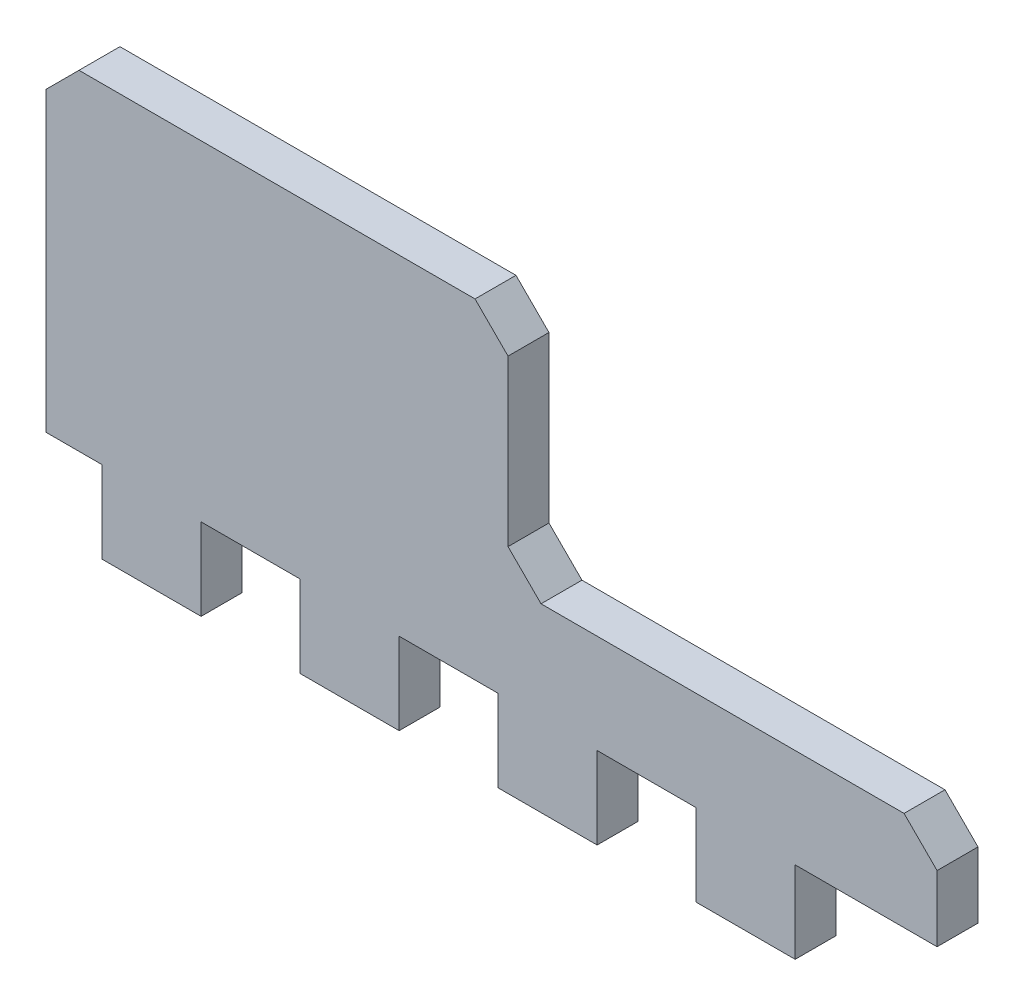
ISO-10303-21;
HEADER;
FILE_DESCRIPTION(('STEP AP214'),'2;1');
FILE_NAME('part.step','',(''),(''),'','','');
FILE_SCHEMA(('AUTOMOTIVE_DESIGN { 1 0 10303 214 1 1 1 1 }'));
ENDSEC;
DATA;
#1=APPLICATION_CONTEXT('core data for automotive mechanical design processes');
#2=APPLICATION_PROTOCOL_DEFINITION('international standard','automotive_design',2000,#1);
#3=PRODUCT_CONTEXT('',#1,'mechanical');
#4=PRODUCT('Part','Part','',(#3));
#5=PRODUCT_RELATED_PRODUCT_CATEGORY('part','',(#4));
#6=PRODUCT_DEFINITION_FORMATION('','',#4);
#7=PRODUCT_DEFINITION_CONTEXT('part definition',#1,'design');
#8=PRODUCT_DEFINITION('design','',#6,#7);
#9=PRODUCT_DEFINITION_SHAPE('','',#8);
#10=(LENGTH_UNIT() NAMED_UNIT(*) SI_UNIT(.MILLI.,.METRE.));
#11=(NAMED_UNIT(*) PLANE_ANGLE_UNIT() SI_UNIT($,.RADIAN.));
#12=(NAMED_UNIT(*) SI_UNIT($,.STERADIAN.) SOLID_ANGLE_UNIT());
#13=UNCERTAINTY_MEASURE_WITH_UNIT(LENGTH_MEASURE(1.E-05),#10,'distance_accuracy_value','');
#14=(GEOMETRIC_REPRESENTATION_CONTEXT(3) GLOBAL_UNCERTAINTY_ASSIGNED_CONTEXT((#13)) GLOBAL_UNIT_ASSIGNED_CONTEXT((#10,
#11,#12)) REPRESENTATION_CONTEXT('',''));
#15=CARTESIAN_POINT('',(0.,0.,0.));
#16=DIRECTION('',(0.,0.,1.));
#17=DIRECTION('',(1.,0.,0.));
#18=AXIS2_PLACEMENT_3D('',#15,#16,#17);
#19=CARTESIAN_POINT('',(0.,0.,12.4));
#20=DIRECTION('',(1.,0.,0.));
#21=DIRECTION('',(0.,0.,-1.));
#22=AXIS2_PLACEMENT_3D('',#19,#20,#21);
#23=PLANE('',#22);
#24=DIRECTION('',(0.,-1.,0.));
#25=VECTOR('',#24,1.);
#26=CARTESIAN_POINT('',(0.,0.,0.));
#27=LINE('',#26,#25);
#28=CARTESIAN_POINT('',(0.,90.,0.));
#29=VERTEX_POINT('',#28);
#30=CARTESIAN_POINT('',(0.,0.,0.));
#31=VERTEX_POINT('',#30);
#32=EDGE_CURVE('E237',#29,#31,#27,.T.);
#33=ORIENTED_EDGE('',*,*,#32,.T.);
#34=DIRECTION('',(0.,0.,-1.));
#35=VECTOR('',#34,1.);
#36=CARTESIAN_POINT('',(0.,0.,12.4));
#37=LINE('',#36,#35);
#38=CARTESIAN_POINT('',(0.,0.,12.4));
#39=VERTEX_POINT('',#38);
#40=EDGE_CURVE('E11',#39,#31,#37,.T.);
#41=ORIENTED_EDGE('',*,*,#40,.F.);
#42=DIRECTION('',(0.,-1.,0.));
#43=VECTOR('',#42,1.);
#44=CARTESIAN_POINT('',(0.,0.,12.4));
#45=LINE('',#44,#43);
#46=CARTESIAN_POINT('',(0.,90.,12.4));
#47=VERTEX_POINT('',#46);
#48=EDGE_CURVE('E287',#47,#39,#45,.T.);
#49=ORIENTED_EDGE('',*,*,#48,.F.);
#50=DIRECTION('',(0.,0.,-1.));
#51=VECTOR('',#50,1.);
#52=CARTESIAN_POINT('',(0.,90.,12.4));
#53=LINE('',#52,#51);
#54=EDGE_CURVE('E233',#47,#29,#53,.T.);
#55=ORIENTED_EDGE('',*,*,#54,.T.);
#56=EDGE_LOOP('',(#33,#41,#49,#55));
#57=FACE_BOUND('',#56,.T.);
#58=ADVANCED_FACE('F33',(#57),#23,.F.);
#59=CARTESIAN_POINT('',(0.,0.,12.4));
#60=DIRECTION('',(0.,1.,0.));
#61=DIRECTION('',(-1.,0.,0.));
#62=AXIS2_PLACEMENT_3D('',#59,#60,#61);
#63=PLANE('',#62);
#64=DIRECTION('',(1.,0.,0.));
#65=VECTOR('',#64,1.);
#66=CARTESIAN_POINT('',(0.,0.,0.));
#67=LINE('',#66,#65);
#68=CARTESIAN_POINT('',(17.,0.,0.));
#69=VERTEX_POINT('',#68);
#70=EDGE_CURVE('E240',#31,#69,#67,.T.);
#71=ORIENTED_EDGE('',*,*,#70,.T.);
#72=DIRECTION('',(0.,0.,-1.));
#73=VECTOR('',#72,1.);
#74=CARTESIAN_POINT('',(17.,0.,12.4));
#75=LINE('',#74,#73);
#76=CARTESIAN_POINT('',(17.,0.,12.4));
#77=VERTEX_POINT('',#76);
#78=EDGE_CURVE('E41',#77,#69,#75,.T.);
#79=ORIENTED_EDGE('',*,*,#78,.F.);
#80=DIRECTION('',(1.,0.,0.));
#81=VECTOR('',#80,1.);
#82=CARTESIAN_POINT('',(0.,0.,12.4));
#83=LINE('',#82,#81);
#84=EDGE_CURVE('E146',#39,#77,#83,.T.);
#85=ORIENTED_EDGE('',*,*,#84,.F.);
#86=ORIENTED_EDGE('',*,*,#40,.T.);
#87=EDGE_LOOP('',(#71,#79,#85,#86));
#88=FACE_BOUND('',#87,.T.);
#89=ADVANCED_FACE('F435',(#88),#63,.F.);
#90=CARTESIAN_POINT('',(17.,0.,12.4));
#91=DIRECTION('',(1.,0.,0.));
#92=DIRECTION('',(0.,0.,-1.));
#93=AXIS2_PLACEMENT_3D('',#90,#91,#92);
#94=PLANE('',#93);
#95=DIRECTION('',(0.,-1.,0.));
#96=VECTOR('',#95,1.);
#97=CARTESIAN_POINT('',(17.,0.,0.));
#98=LINE('',#97,#96);
#99=CARTESIAN_POINT('',(17.,-24.8,0.));
#100=VERTEX_POINT('',#99);
#101=EDGE_CURVE('E242',#69,#100,#98,.T.);
#102=ORIENTED_EDGE('',*,*,#101,.T.);
#103=DIRECTION('',(0.,0.,-1.));
#104=VECTOR('',#103,1.);
#105=CARTESIAN_POINT('',(17.,-24.8,12.4));
#106=LINE('',#105,#104);
#107=CARTESIAN_POINT('',(17.,-24.8,12.4));
#108=VERTEX_POINT('',#107);
#109=EDGE_CURVE('E348',#108,#100,#106,.T.);
#110=ORIENTED_EDGE('',*,*,#109,.F.);
#111=DIRECTION('',(0.,-1.,0.));
#112=VECTOR('',#111,1.);
#113=CARTESIAN_POINT('',(17.,0.,12.4));
#114=LINE('',#113,#112);
#115=EDGE_CURVE('E356',#77,#108,#114,.T.);
#116=ORIENTED_EDGE('',*,*,#115,.F.);
#117=ORIENTED_EDGE('',*,*,#78,.T.);
#118=EDGE_LOOP('',(#102,#110,#116,#117));
#119=FACE_BOUND('',#118,.T.);
#120=ADVANCED_FACE('F354',(#119),#94,.F.);
#121=CARTESIAN_POINT('',(17.,-24.8,12.4));
#122=DIRECTION('',(0.,1.,0.));
#123=DIRECTION('',(-1.,0.,0.));
#124=AXIS2_PLACEMENT_3D('',#121,#122,#123);
#125=PLANE('',#124);
#126=DIRECTION('',(1.,0.,0.));
#127=VECTOR('',#126,1.);
#128=CARTESIAN_POINT('',(17.,-24.8,0.));
#129=LINE('',#128,#127);
#130=CARTESIAN_POINT('',(47.,-24.8,0.));
#131=VERTEX_POINT('',#130);
#132=EDGE_CURVE('E244',#100,#131,#129,.T.);
#133=ORIENTED_EDGE('',*,*,#132,.T.);
#134=DIRECTION('',(0.,0.,-1.));
#135=VECTOR('',#134,1.);
#136=CARTESIAN_POINT('',(47.,-24.8,12.4));
#137=LINE('',#136,#135);
#138=CARTESIAN_POINT('',(47.,-24.8,12.4));
#139=VERTEX_POINT('',#138);
#140=EDGE_CURVE('E345',#139,#131,#137,.T.);
#141=ORIENTED_EDGE('',*,*,#140,.F.);
#142=DIRECTION('',(1.,0.,0.));
#143=VECTOR('',#142,1.);
#144=CARTESIAN_POINT('',(17.,-24.8,12.4));
#145=LINE('',#144,#143);
#146=EDGE_CURVE('E374',#108,#139,#145,.T.);
#147=ORIENTED_EDGE('',*,*,#146,.F.);
#148=ORIENTED_EDGE('',*,*,#109,.T.);
#149=EDGE_LOOP('',(#133,#141,#147,#148));
#150=FACE_BOUND('',#149,.T.);
#151=ADVANCED_FACE('F365',(#150),#125,.F.);
#152=CARTESIAN_POINT('',(47.,0.,12.4));
#153=DIRECTION('',(-1.,0.,0.));
#154=DIRECTION('',(0.,-1.,0.));
#155=AXIS2_PLACEMENT_3D('',#152,#153,#154);
#156=PLANE('',#155);
#157=DIRECTION('',(0.,1.,0.));
#158=VECTOR('',#157,1.);
#159=CARTESIAN_POINT('',(47.,0.,0.));
#160=LINE('',#159,#158);
#161=CARTESIAN_POINT('',(47.,0.,0.));
#162=VERTEX_POINT('',#161);
#163=EDGE_CURVE('E246',#131,#162,#160,.T.);
#164=ORIENTED_EDGE('',*,*,#163,.T.);
#165=DIRECTION('',(0.,0.,-1.));
#166=VECTOR('',#165,1.);
#167=CARTESIAN_POINT('',(47.,0.,12.4));
#168=LINE('',#167,#166);
#169=CARTESIAN_POINT('',(47.,0.,12.4));
#170=VERTEX_POINT('',#169);
#171=EDGE_CURVE('E342',#170,#162,#168,.T.);
#172=ORIENTED_EDGE('',*,*,#171,.F.);
#173=DIRECTION('',(0.,1.,0.));
#174=VECTOR('',#173,1.);
#175=CARTESIAN_POINT('',(47.,0.,12.4));
#176=LINE('',#175,#174);
#177=EDGE_CURVE('E371',#139,#170,#176,.T.);
#178=ORIENTED_EDGE('',*,*,#177,.F.);
#179=ORIENTED_EDGE('',*,*,#140,.T.);
#180=EDGE_LOOP('',(#164,#172,#178,#179));
#181=FACE_BOUND('',#180,.T.);
#182=ADVANCED_FACE('F369',(#181),#156,.F.);
#183=CARTESIAN_POINT('',(47.,0.,12.4));
#184=DIRECTION('',(0.,1.,0.));
#185=DIRECTION('',(-1.,0.,0.));
#186=AXIS2_PLACEMENT_3D('',#183,#184,#185);
#187=PLANE('',#186);
#188=DIRECTION('',(1.,0.,0.));
#189=VECTOR('',#188,1.);
#190=CARTESIAN_POINT('',(47.,0.,0.));
#191=LINE('',#190,#189);
#192=CARTESIAN_POINT('',(76.9999999999999,0.,0.));
#193=VERTEX_POINT('',#192);
#194=EDGE_CURVE('E248',#162,#193,#191,.T.);
#195=ORIENTED_EDGE('',*,*,#194,.T.);
#196=DIRECTION('',(0.,0.,-1.));
#197=VECTOR('',#196,1.);
#198=CARTESIAN_POINT('',(76.9999999999999,0.,12.4));
#199=LINE('',#198,#197);
#200=CARTESIAN_POINT('',(76.9999999999999,0.,12.4));
#201=VERTEX_POINT('',#200);
#202=EDGE_CURVE('E339',#201,#193,#199,.T.);
#203=ORIENTED_EDGE('',*,*,#202,.F.);
#204=DIRECTION('',(1.,0.,0.));
#205=VECTOR('',#204,1.);
#206=CARTESIAN_POINT('',(47.,0.,12.4));
#207=LINE('',#206,#205);
#208=EDGE_CURVE('E373',#170,#201,#207,.T.);
#209=ORIENTED_EDGE('',*,*,#208,.F.);
#210=ORIENTED_EDGE('',*,*,#171,.T.);
#211=EDGE_LOOP('',(#195,#203,#209,#210));
#212=FACE_BOUND('',#211,.T.);
#213=ADVANCED_FACE('F448',(#212),#187,.F.);
#214=CARTESIAN_POINT('',(76.9999999999999,0.,12.4));
#215=DIRECTION('',(1.,0.,0.));
#216=DIRECTION('',(0.,0.,-1.));
#217=AXIS2_PLACEMENT_3D('',#214,#215,#216);
#218=PLANE('',#217);
#219=DIRECTION('',(0.,-1.,0.));
#220=VECTOR('',#219,1.);
#221=CARTESIAN_POINT('',(76.9999999999999,0.,0.));
#222=LINE('',#221,#220);
#223=CARTESIAN_POINT('',(76.9999999999999,-24.8,0.));
#224=VERTEX_POINT('',#223);
#225=EDGE_CURVE('E250',#193,#224,#222,.T.);
#226=ORIENTED_EDGE('',*,*,#225,.T.);
#227=DIRECTION('',(0.,0.,-1.));
#228=VECTOR('',#227,1.);
#229=CARTESIAN_POINT('',(76.9999999999999,-24.8,12.4));
#230=LINE('',#229,#228);
#231=CARTESIAN_POINT('',(76.9999999999999,-24.8,12.4));
#232=VERTEX_POINT('',#231);
#233=EDGE_CURVE('E336',#232,#224,#230,.T.);
#234=ORIENTED_EDGE('',*,*,#233,.F.);
#235=DIRECTION('',(0.,-1.,0.));
#236=VECTOR('',#235,1.);
#237=CARTESIAN_POINT('',(76.9999999999999,0.,12.4));
#238=LINE('',#237,#236);
#239=EDGE_CURVE('E376',#201,#232,#238,.T.);
#240=ORIENTED_EDGE('',*,*,#239,.F.);
#241=ORIENTED_EDGE('',*,*,#202,.T.);
#242=EDGE_LOOP('',(#226,#234,#240,#241));
#243=FACE_BOUND('',#242,.T.);
#244=ADVANCED_FACE('F451',(#243),#218,.F.);
#245=CARTESIAN_POINT('',(76.9999999999999,-24.8,12.4));
#246=DIRECTION('',(0.,1.,0.));
#247=DIRECTION('',(-1.,0.,0.));
#248=AXIS2_PLACEMENT_3D('',#245,#246,#247);
#249=PLANE('',#248);
#250=DIRECTION('',(1.,0.,0.));
#251=VECTOR('',#250,1.);
#252=CARTESIAN_POINT('',(76.9999999999999,-24.8,0.));
#253=LINE('',#252,#251);
#254=CARTESIAN_POINT('',(107.,-24.8,0.));
#255=VERTEX_POINT('',#254);
#256=EDGE_CURVE('E252',#224,#255,#253,.T.);
#257=ORIENTED_EDGE('',*,*,#256,.T.);
#258=DIRECTION('',(0.,0.,-1.));
#259=VECTOR('',#258,1.);
#260=CARTESIAN_POINT('',(107.,-24.8,12.4));
#261=LINE('',#260,#259);
#262=CARTESIAN_POINT('',(107.,-24.8,12.4));
#263=VERTEX_POINT('',#262);
#264=EDGE_CURVE('E333',#263,#255,#261,.T.);
#265=ORIENTED_EDGE('',*,*,#264,.F.);
#266=DIRECTION('',(1.,0.,0.));
#267=VECTOR('',#266,1.);
#268=CARTESIAN_POINT('',(76.9999999999999,-24.8,12.4));
#269=LINE('',#268,#267);
#270=EDGE_CURVE('E382',#232,#263,#269,.T.);
#271=ORIENTED_EDGE('',*,*,#270,.F.);
#272=ORIENTED_EDGE('',*,*,#233,.T.);
#273=EDGE_LOOP('',(#257,#265,#271,#272));
#274=FACE_BOUND('',#273,.T.);
#275=ADVANCED_FACE('F455',(#274),#249,.F.);
#276=CARTESIAN_POINT('',(107.,0.,12.4));
#277=DIRECTION('',(-1.,0.,0.));
#278=DIRECTION('',(0.,-1.,0.));
#279=AXIS2_PLACEMENT_3D('',#276,#277,#278);
#280=PLANE('',#279);
#281=DIRECTION('',(0.,1.,0.));
#282=VECTOR('',#281,1.);
#283=CARTESIAN_POINT('',(107.,0.,0.));
#284=LINE('',#283,#282);
#285=CARTESIAN_POINT('',(107.,0.,0.));
#286=VERTEX_POINT('',#285);
#287=EDGE_CURVE('E254',#255,#286,#284,.T.);
#288=ORIENTED_EDGE('',*,*,#287,.T.);
#289=DIRECTION('',(0.,0.,-1.));
#290=VECTOR('',#289,1.);
#291=CARTESIAN_POINT('',(107.,0.,12.4));
#292=LINE('',#291,#290);
#293=CARTESIAN_POINT('',(107.,0.,12.4));
#294=VERTEX_POINT('',#293);
#295=EDGE_CURVE('E330',#294,#286,#292,.T.);
#296=ORIENTED_EDGE('',*,*,#295,.F.);
#297=DIRECTION('',(0.,1.,0.));
#298=VECTOR('',#297,1.);
#299=CARTESIAN_POINT('',(107.,0.,12.4));
#300=LINE('',#299,#298);
#301=EDGE_CURVE('E384',#263,#294,#300,.T.);
#302=ORIENTED_EDGE('',*,*,#301,.F.);
#303=ORIENTED_EDGE('',*,*,#264,.T.);
#304=EDGE_LOOP('',(#288,#296,#302,#303));
#305=FACE_BOUND('',#304,.T.);
#306=ADVANCED_FACE('F459',(#305),#280,.F.);
#307=CARTESIAN_POINT('',(107.,0.,12.4));
#308=DIRECTION('',(0.,1.,0.));
#309=DIRECTION('',(-1.,0.,0.));
#310=AXIS2_PLACEMENT_3D('',#307,#308,#309);
#311=PLANE('',#310);
#312=DIRECTION('',(1.,0.,0.));
#313=VECTOR('',#312,1.);
#314=CARTESIAN_POINT('',(107.,0.,0.));
#315=LINE('',#314,#313);
#316=CARTESIAN_POINT('',(137.,0.,0.));
#317=VERTEX_POINT('',#316);
#318=EDGE_CURVE('E256',#286,#317,#315,.T.);
#319=ORIENTED_EDGE('',*,*,#318,.T.);
#320=DIRECTION('',(0.,0.,-1.));
#321=VECTOR('',#320,1.);
#322=CARTESIAN_POINT('',(137.,0.,12.4));
#323=LINE('',#322,#321);
#324=CARTESIAN_POINT('',(137.,0.,12.4));
#325=VERTEX_POINT('',#324);
#326=EDGE_CURVE('E327',#325,#317,#323,.T.);
#327=ORIENTED_EDGE('',*,*,#326,.F.);
#328=DIRECTION('',(1.,0.,0.));
#329=VECTOR('',#328,1.);
#330=CARTESIAN_POINT('',(107.,0.,12.4));
#331=LINE('',#330,#329);
#332=EDGE_CURVE('E386',#294,#325,#331,.T.);
#333=ORIENTED_EDGE('',*,*,#332,.F.);
#334=ORIENTED_EDGE('',*,*,#295,.T.);
#335=EDGE_LOOP('',(#319,#327,#333,#334));
#336=FACE_BOUND('',#335,.T.);
#337=ADVANCED_FACE('F463',(#336),#311,.F.);
#338=CARTESIAN_POINT('',(137.,0.,12.4));
#339=DIRECTION('',(1.,0.,0.));
#340=DIRECTION('',(0.,1.,0.));
#341=AXIS2_PLACEMENT_3D('',#338,#339,#340);
#342=PLANE('',#341);
#343=DIRECTION('',(0.,-1.,0.));
#344=VECTOR('',#343,1.);
#345=CARTESIAN_POINT('',(137.,0.,0.));
#346=LINE('',#345,#344);
#347=CARTESIAN_POINT('',(137.,-24.8,0.));
#348=VERTEX_POINT('',#347);
#349=EDGE_CURVE('E258',#317,#348,#346,.T.);
#350=ORIENTED_EDGE('',*,*,#349,.T.);
#351=DIRECTION('',(0.,0.,-1.));
#352=VECTOR('',#351,1.);
#353=CARTESIAN_POINT('',(137.,-24.8,12.4));
#354=LINE('',#353,#352);
#355=CARTESIAN_POINT('',(137.,-24.8,12.4));
#356=VERTEX_POINT('',#355);
#357=EDGE_CURVE('E324',#356,#348,#354,.T.);
#358=ORIENTED_EDGE('',*,*,#357,.F.);
#359=DIRECTION('',(0.,-1.,0.));
#360=VECTOR('',#359,1.);
#361=CARTESIAN_POINT('',(137.,0.,12.4));
#362=LINE('',#361,#360);
#363=EDGE_CURVE('E388',#325,#356,#362,.T.);
#364=ORIENTED_EDGE('',*,*,#363,.F.);
#365=ORIENTED_EDGE('',*,*,#326,.T.);
#366=EDGE_LOOP('',(#350,#358,#364,#365));
#367=FACE_BOUND('',#366,.T.);
#368=ADVANCED_FACE('F467',(#367),#342,.F.);
#369=CARTESIAN_POINT('',(137.,-24.8,12.4));
#370=DIRECTION('',(0.,1.,0.));
#371=DIRECTION('',(-1.,0.,0.));
#372=AXIS2_PLACEMENT_3D('',#369,#370,#371);
#373=PLANE('',#372);
#374=DIRECTION('',(1.,0.,0.));
#375=VECTOR('',#374,1.);
#376=CARTESIAN_POINT('',(137.,-24.8,0.));
#377=LINE('',#376,#375);
#378=CARTESIAN_POINT('',(167.,-24.8,0.));
#379=VERTEX_POINT('',#378);
#380=EDGE_CURVE('E260',#348,#379,#377,.T.);
#381=ORIENTED_EDGE('',*,*,#380,.T.);
#382=DIRECTION('',(0.,0.,-1.));
#383=VECTOR('',#382,1.);
#384=CARTESIAN_POINT('',(167.,-24.8,12.4));
#385=LINE('',#384,#383);
#386=CARTESIAN_POINT('',(167.,-24.8,12.4));
#387=VERTEX_POINT('',#386);
#388=EDGE_CURVE('E321',#387,#379,#385,.T.);
#389=ORIENTED_EDGE('',*,*,#388,.F.);
#390=DIRECTION('',(1.,0.,0.));
#391=VECTOR('',#390,1.);
#392=CARTESIAN_POINT('',(137.,-24.8,12.4));
#393=LINE('',#392,#391);
#394=EDGE_CURVE('E390',#356,#387,#393,.T.);
#395=ORIENTED_EDGE('',*,*,#394,.F.);
#396=ORIENTED_EDGE('',*,*,#357,.T.);
#397=EDGE_LOOP('',(#381,#389,#395,#396));
#398=FACE_BOUND('',#397,.T.);
#399=ADVANCED_FACE('F471',(#398),#373,.F.);
#400=CARTESIAN_POINT('',(167.,0.,12.4));
#401=DIRECTION('',(-1.,0.,0.));
#402=DIRECTION('',(0.,-1.,0.));
#403=AXIS2_PLACEMENT_3D('',#400,#401,#402);
#404=PLANE('',#403);
#405=DIRECTION('',(0.,1.,0.));
#406=VECTOR('',#405,1.);
#407=CARTESIAN_POINT('',(167.,0.,0.));
#408=LINE('',#407,#406);
#409=CARTESIAN_POINT('',(167.,0.,0.));
#410=VERTEX_POINT('',#409);
#411=EDGE_CURVE('E262',#379,#410,#408,.T.);
#412=ORIENTED_EDGE('',*,*,#411,.T.);
#413=DIRECTION('',(0.,0.,-1.));
#414=VECTOR('',#413,1.);
#415=CARTESIAN_POINT('',(167.,0.,12.4));
#416=LINE('',#415,#414);
#417=CARTESIAN_POINT('',(167.,0.,12.4));
#418=VERTEX_POINT('',#417);
#419=EDGE_CURVE('E318',#418,#410,#416,.T.);
#420=ORIENTED_EDGE('',*,*,#419,.F.);
#421=DIRECTION('',(0.,1.,0.));
#422=VECTOR('',#421,1.);
#423=CARTESIAN_POINT('',(167.,0.,12.4));
#424=LINE('',#423,#422);
#425=EDGE_CURVE('E392',#387,#418,#424,.T.);
#426=ORIENTED_EDGE('',*,*,#425,.F.);
#427=ORIENTED_EDGE('',*,*,#388,.T.);
#428=EDGE_LOOP('',(#412,#420,#426,#427));
#429=FACE_BOUND('',#428,.T.);
#430=ADVANCED_FACE('F475',(#429),#404,.F.);
#431=CARTESIAN_POINT('',(167.,0.,12.4));
#432=DIRECTION('',(0.,1.,0.));
#433=DIRECTION('',(-1.,0.,0.));
#434=AXIS2_PLACEMENT_3D('',#431,#432,#433);
#435=PLANE('',#434);
#436=DIRECTION('',(1.,0.,0.));
#437=VECTOR('',#436,1.);
#438=CARTESIAN_POINT('',(167.,0.,0.));
#439=LINE('',#438,#437);
#440=CARTESIAN_POINT('',(197.,0.,0.));
#441=VERTEX_POINT('',#440);
#442=EDGE_CURVE('E264',#410,#441,#439,.T.);
#443=ORIENTED_EDGE('',*,*,#442,.T.);
#444=DIRECTION('',(0.,0.,-1.));
#445=VECTOR('',#444,1.);
#446=CARTESIAN_POINT('',(197.,0.,12.4));
#447=LINE('',#446,#445);
#448=CARTESIAN_POINT('',(197.,0.,12.4));
#449=VERTEX_POINT('',#448);
#450=EDGE_CURVE('E315',#449,#441,#447,.T.);
#451=ORIENTED_EDGE('',*,*,#450,.F.);
#452=DIRECTION('',(1.,0.,0.));
#453=VECTOR('',#452,1.);
#454=CARTESIAN_POINT('',(167.,0.,12.4));
#455=LINE('',#454,#453);
#456=EDGE_CURVE('E394',#418,#449,#455,.T.);
#457=ORIENTED_EDGE('',*,*,#456,.F.);
#458=ORIENTED_EDGE('',*,*,#419,.T.);
#459=EDGE_LOOP('',(#443,#451,#457,#458));
#460=FACE_BOUND('',#459,.T.);
#461=ADVANCED_FACE('F479',(#460),#435,.F.);
#462=CARTESIAN_POINT('',(197.,0.,12.4));
#463=DIRECTION('',(1.,0.,0.));
#464=DIRECTION('',(0.,0.,-1.));
#465=AXIS2_PLACEMENT_3D('',#462,#463,#464);
#466=PLANE('',#465);
#467=DIRECTION('',(0.,-1.,0.));
#468=VECTOR('',#467,1.);
#469=CARTESIAN_POINT('',(197.,0.,0.));
#470=LINE('',#469,#468);
#471=CARTESIAN_POINT('',(197.,-24.8,0.));
#472=VERTEX_POINT('',#471);
#473=EDGE_CURVE('E266',#441,#472,#470,.T.);
#474=ORIENTED_EDGE('',*,*,#473,.T.);
#475=DIRECTION('',(0.,0.,-1.));
#476=VECTOR('',#475,1.);
#477=CARTESIAN_POINT('',(197.,-24.8,12.4));
#478=LINE('',#477,#476);
#479=CARTESIAN_POINT('',(197.,-24.8,12.4));
#480=VERTEX_POINT('',#479);
#481=EDGE_CURVE('E312',#480,#472,#478,.T.);
#482=ORIENTED_EDGE('',*,*,#481,.F.);
#483=DIRECTION('',(0.,-1.,0.));
#484=VECTOR('',#483,1.);
#485=CARTESIAN_POINT('',(197.,0.,12.4));
#486=LINE('',#485,#484);
#487=EDGE_CURVE('E396',#449,#480,#486,.T.);
#488=ORIENTED_EDGE('',*,*,#487,.F.);
#489=ORIENTED_EDGE('',*,*,#450,.T.);
#490=EDGE_LOOP('',(#474,#482,#488,#489));
#491=FACE_BOUND('',#490,.T.);
#492=ADVANCED_FACE('F483',(#491),#466,.F.);
#493=CARTESIAN_POINT('',(197.,-24.8,12.4));
#494=DIRECTION('',(0.,1.,0.));
#495=DIRECTION('',(-1.,0.,0.));
#496=AXIS2_PLACEMENT_3D('',#493,#494,#495);
#497=PLANE('',#496);
#498=DIRECTION('',(1.,0.,0.));
#499=VECTOR('',#498,1.);
#500=CARTESIAN_POINT('',(197.,-24.8,0.));
#501=LINE('',#500,#499);
#502=CARTESIAN_POINT('',(227.,-24.8,0.));
#503=VERTEX_POINT('',#502);
#504=EDGE_CURVE('E268',#472,#503,#501,.T.);
#505=ORIENTED_EDGE('',*,*,#504,.T.);
#506=DIRECTION('',(0.,0.,-1.));
#507=VECTOR('',#506,1.);
#508=CARTESIAN_POINT('',(227.,-24.8,12.4));
#509=LINE('',#508,#507);
#510=CARTESIAN_POINT('',(227.,-24.8,12.4));
#511=VERTEX_POINT('',#510);
#512=EDGE_CURVE('E309',#511,#503,#509,.T.);
#513=ORIENTED_EDGE('',*,*,#512,.F.);
#514=DIRECTION('',(1.,0.,0.));
#515=VECTOR('',#514,1.);
#516=CARTESIAN_POINT('',(197.,-24.8,12.4));
#517=LINE('',#516,#515);
#518=EDGE_CURVE('E398',#480,#511,#517,.T.);
#519=ORIENTED_EDGE('',*,*,#518,.F.);
#520=ORIENTED_EDGE('',*,*,#481,.T.);
#521=EDGE_LOOP('',(#505,#513,#519,#520));
#522=FACE_BOUND('',#521,.T.);
#523=ADVANCED_FACE('F487',(#522),#497,.F.);
#524=CARTESIAN_POINT('',(227.,0.,12.4));
#525=DIRECTION('',(-1.,0.,0.));
#526=DIRECTION('',(0.,-1.,0.));
#527=AXIS2_PLACEMENT_3D('',#524,#525,#526);
#528=PLANE('',#527);
#529=DIRECTION('',(0.,1.,0.));
#530=VECTOR('',#529,1.);
#531=CARTESIAN_POINT('',(227.,0.,0.));
#532=LINE('',#531,#530);
#533=CARTESIAN_POINT('',(227.,0.,0.));
#534=VERTEX_POINT('',#533);
#535=EDGE_CURVE('E270',#503,#534,#532,.T.);
#536=ORIENTED_EDGE('',*,*,#535,.T.);
#537=DIRECTION('',(0.,0.,-1.));
#538=VECTOR('',#537,1.);
#539=CARTESIAN_POINT('',(227.,0.,12.4));
#540=LINE('',#539,#538);
#541=CARTESIAN_POINT('',(227.,0.,12.4));
#542=VERTEX_POINT('',#541);
#543=EDGE_CURVE('E306',#542,#534,#540,.T.);
#544=ORIENTED_EDGE('',*,*,#543,.F.);
#545=DIRECTION('',(0.,1.,0.));
#546=VECTOR('',#545,1.);
#547=CARTESIAN_POINT('',(227.,0.,12.4));
#548=LINE('',#547,#546);
#549=EDGE_CURVE('E400',#511,#542,#548,.T.);
#550=ORIENTED_EDGE('',*,*,#549,.F.);
#551=ORIENTED_EDGE('',*,*,#512,.T.);
#552=EDGE_LOOP('',(#536,#544,#550,#551));
#553=FACE_BOUND('',#552,.T.);
#554=ADVANCED_FACE('F491',(#553),#528,.F.);
#555=CARTESIAN_POINT('',(227.,0.,12.4));
#556=DIRECTION('',(0.,1.,0.));
#557=DIRECTION('',(-1.,0.,0.));
#558=AXIS2_PLACEMENT_3D('',#555,#556,#557);
#559=PLANE('',#558);
#560=DIRECTION('',(1.,0.,0.));
#561=VECTOR('',#560,1.);
#562=CARTESIAN_POINT('',(227.,0.,0.));
#563=LINE('',#562,#561);
#564=CARTESIAN_POINT('',(270.,0.,0.));
#565=VERTEX_POINT('',#564);
#566=EDGE_CURVE('E272',#534,#565,#563,.T.);
#567=ORIENTED_EDGE('',*,*,#566,.T.);
#568=DIRECTION('',(0.,0.,-1.));
#569=VECTOR('',#568,1.);
#570=CARTESIAN_POINT('',(270.,0.,12.4));
#571=LINE('',#570,#569);
#572=CARTESIAN_POINT('',(270.,0.,12.4));
#573=VERTEX_POINT('',#572);
#574=EDGE_CURVE('E303',#573,#565,#571,.T.);
#575=ORIENTED_EDGE('',*,*,#574,.F.);
#576=DIRECTION('',(1.,0.,0.));
#577=VECTOR('',#576,1.);
#578=CARTESIAN_POINT('',(227.,0.,12.4));
#579=LINE('',#578,#577);
#580=EDGE_CURVE('E402',#542,#573,#579,.T.);
#581=ORIENTED_EDGE('',*,*,#580,.F.);
#582=ORIENTED_EDGE('',*,*,#543,.T.);
#583=EDGE_LOOP('',(#567,#575,#581,#582));
#584=FACE_BOUND('',#583,.T.);
#585=ADVANCED_FACE('F495',(#584),#559,.F.);
#586=CARTESIAN_POINT('',(270.,0.,12.4));
#587=DIRECTION('',(-1.,0.,0.));
#588=DIRECTION('',(0.,0.,1.));
#589=AXIS2_PLACEMENT_3D('',#586,#587,#588);
#590=PLANE('',#589);
#591=DIRECTION('',(0.,1.,0.));
#592=VECTOR('',#591,1.);
#593=CARTESIAN_POINT('',(270.,0.,0.));
#594=LINE('',#593,#592);
#595=CARTESIAN_POINT('',(270.,20.,0.));
#596=VERTEX_POINT('',#595);
#597=EDGE_CURVE('E274',#565,#596,#594,.T.);
#598=ORIENTED_EDGE('',*,*,#597,.T.);
#599=DIRECTION('',(0.,0.,-1.));
#600=VECTOR('',#599,1.);
#601=CARTESIAN_POINT('',(270.,20.,12.4));
#602=LINE('',#601,#600);
#603=CARTESIAN_POINT('',(270.,20.,12.4));
#604=VERTEX_POINT('',#603);
#605=EDGE_CURVE('E300',#604,#596,#602,.T.);
#606=ORIENTED_EDGE('',*,*,#605,.F.);
#607=DIRECTION('',(0.,1.,0.));
#608=VECTOR('',#607,1.);
#609=CARTESIAN_POINT('',(270.,0.,12.4));
#610=LINE('',#609,#608);
#611=EDGE_CURVE('E404',#573,#604,#610,.T.);
#612=ORIENTED_EDGE('',*,*,#611,.F.);
#613=ORIENTED_EDGE('',*,*,#574,.T.);
#614=EDGE_LOOP('',(#598,#606,#612,#613));
#615=FACE_BOUND('',#614,.T.);
#616=ADVANCED_FACE('F499',(#615),#590,.F.);
#617=CARTESIAN_POINT('',(270.,20.,12.4));
#618=DIRECTION('',(-0.707106781186547,-0.707106781186547,0.));
#619=DIRECTION('',(0.707106781186548,-0.707106781186548,0.));
#620=AXIS2_PLACEMENT_3D('',#617,#618,#619);
#621=PLANE('',#620);
#622=DIRECTION('',(-0.707106781186547,0.707106781186547,0.));
#623=VECTOR('',#622,1.);
#624=CARTESIAN_POINT('',(270.,20.,0.));
#625=LINE('',#624,#623);
#626=CARTESIAN_POINT('',(260.,30.,0.));
#627=VERTEX_POINT('',#626);
#628=EDGE_CURVE('E276',#596,#627,#625,.T.);
#629=ORIENTED_EDGE('',*,*,#628,.T.);
#630=DIRECTION('',(0.,0.,-1.));
#631=VECTOR('',#630,1.);
#632=CARTESIAN_POINT('',(260.,30.,12.4));
#633=LINE('',#632,#631);
#634=CARTESIAN_POINT('',(260.,30.,12.4));
#635=VERTEX_POINT('',#634);
#636=EDGE_CURVE('E297',#635,#627,#633,.T.);
#637=ORIENTED_EDGE('',*,*,#636,.F.);
#638=DIRECTION('',(-0.707106781186547,0.707106781186547,0.));
#639=VECTOR('',#638,1.);
#640=CARTESIAN_POINT('',(270.,20.,12.4));
#641=LINE('',#640,#639);
#642=EDGE_CURVE('E406',#604,#635,#641,.T.);
#643=ORIENTED_EDGE('',*,*,#642,.F.);
#644=ORIENTED_EDGE('',*,*,#605,.T.);
#645=EDGE_LOOP('',(#629,#637,#643,#644));
#646=FACE_BOUND('',#645,.T.);
#647=ADVANCED_FACE('F503',(#646),#621,.F.);
#648=CARTESIAN_POINT('',(150.,30.,12.4));
#649=DIRECTION('',(0.,-1.,0.));
#650=DIRECTION('',(0.,0.,-1.));
#651=AXIS2_PLACEMENT_3D('',#648,#649,#650);
#652=PLANE('',#651);
#653=DIRECTION('',(-1.,0.,0.));
#654=VECTOR('',#653,1.);
#655=CARTESIAN_POINT('',(150.,30.,0.));
#656=LINE('',#655,#654);
#657=CARTESIAN_POINT('',(150.,30.,0.));
#658=VERTEX_POINT('',#657);
#659=EDGE_CURVE('E278',#627,#658,#656,.T.);
#660=ORIENTED_EDGE('',*,*,#659,.T.);
#661=DIRECTION('',(0.,0.,-1.));
#662=VECTOR('',#661,1.);
#663=CARTESIAN_POINT('',(150.,30.,12.4));
#664=LINE('',#663,#662);
#665=CARTESIAN_POINT('',(150.,30.,12.4));
#666=VERTEX_POINT('',#665);
#667=EDGE_CURVE('E294',#666,#658,#664,.T.);
#668=ORIENTED_EDGE('',*,*,#667,.F.);
#669=DIRECTION('',(-1.,0.,0.));
#670=VECTOR('',#669,1.);
#671=CARTESIAN_POINT('',(150.,30.,12.4));
#672=LINE('',#671,#670);
#673=EDGE_CURVE('E408',#635,#666,#672,.T.);
#674=ORIENTED_EDGE('',*,*,#673,.F.);
#675=ORIENTED_EDGE('',*,*,#636,.T.);
#676=EDGE_LOOP('',(#660,#668,#674,#675));
#677=FACE_BOUND('',#676,.T.);
#678=ADVANCED_FACE('F507',(#677),#652,.F.);
#679=CARTESIAN_POINT('',(140.,40.,12.4));
#680=DIRECTION('',(-0.70710678118655,-0.707106781186545,0.));
#681=DIRECTION('',(0.707106781186545,-0.70710678118655,0.));
#682=AXIS2_PLACEMENT_3D('',#679,#680,#681);
#683=PLANE('',#682);
#684=DIRECTION('',(-0.707106781186545,0.70710678118655,0.));
#685=VECTOR('',#684,1.);
#686=CARTESIAN_POINT('',(140.,40.,0.));
#687=LINE('',#686,#685);
#688=CARTESIAN_POINT('',(140.,40.,0.));
#689=VERTEX_POINT('',#688);
#690=EDGE_CURVE('E280',#658,#689,#687,.T.);
#691=ORIENTED_EDGE('',*,*,#690,.T.);
#692=DIRECTION('',(0.,0.,-1.));
#693=VECTOR('',#692,1.);
#694=CARTESIAN_POINT('',(140.,40.,12.4));
#695=LINE('',#694,#693);
#696=CARTESIAN_POINT('',(140.,40.,12.4));
#697=VERTEX_POINT('',#696);
#698=EDGE_CURVE('E291',#697,#689,#695,.T.);
#699=ORIENTED_EDGE('',*,*,#698,.F.);
#700=DIRECTION('',(-0.707106781186545,0.70710678118655,0.));
#701=VECTOR('',#700,1.);
#702=CARTESIAN_POINT('',(140.,40.,12.4));
#703=LINE('',#702,#701);
#704=EDGE_CURVE('E410',#666,#697,#703,.T.);
#705=ORIENTED_EDGE('',*,*,#704,.F.);
#706=ORIENTED_EDGE('',*,*,#667,.T.);
#707=EDGE_LOOP('',(#691,#699,#705,#706));
#708=FACE_BOUND('',#707,.T.);
#709=ADVANCED_FACE('F416',(#708),#683,.F.);
#710=CARTESIAN_POINT('',(140.,40.,12.4));
#711=DIRECTION('',(-1.,0.,0.));
#712=DIRECTION('',(0.,0.,1.));
#713=AXIS2_PLACEMENT_3D('',#710,#711,#712);
#714=PLANE('',#713);
#715=DIRECTION('',(0.,1.,0.));
#716=VECTOR('',#715,1.);
#717=CARTESIAN_POINT('',(140.,40.,0.));
#718=LINE('',#717,#716);
#719=CARTESIAN_POINT('',(140.,89.9999999999999,0.));
#720=VERTEX_POINT('',#719);
#721=EDGE_CURVE('E282',#689,#720,#718,.T.);
#722=ORIENTED_EDGE('',*,*,#721,.T.);
#723=DIRECTION('',(0.,0.,-1.));
#724=VECTOR('',#723,1.);
#725=CARTESIAN_POINT('',(140.,89.9999999999999,12.4));
#726=LINE('',#725,#724);
#727=CARTESIAN_POINT('',(140.,89.9999999999999,12.4));
#728=VERTEX_POINT('',#727);
#729=EDGE_CURVE('E228',#728,#720,#726,.T.);
#730=ORIENTED_EDGE('',*,*,#729,.F.);
#731=DIRECTION('',(0.,1.,0.));
#732=VECTOR('',#731,1.);
#733=CARTESIAN_POINT('',(140.,40.,12.4));
#734=LINE('',#733,#732);
#735=EDGE_CURVE('E219',#697,#728,#734,.T.);
#736=ORIENTED_EDGE('',*,*,#735,.F.);
#737=ORIENTED_EDGE('',*,*,#698,.T.);
#738=EDGE_LOOP('',(#722,#730,#736,#737));
#739=FACE_BOUND('',#738,.T.);
#740=ADVANCED_FACE('F420',(#739),#714,.F.);
#741=CARTESIAN_POINT('',(140.,89.9999999999999,12.4));
#742=DIRECTION('',(-0.707106781186551,-0.707106781186545,0.));
#743=DIRECTION('',(0.707106781186545,-0.70710678118655,0.));
#744=AXIS2_PLACEMENT_3D('',#741,#742,#743);
#745=PLANE('',#744);
#746=DIRECTION('',(-0.707106781186545,0.707106781186551,0.));
#747=VECTOR('',#746,1.);
#748=CARTESIAN_POINT('',(140.,89.9999999999999,0.));
#749=LINE('',#748,#747);
#750=CARTESIAN_POINT('',(130.,100.,0.));
#751=VERTEX_POINT('',#750);
#752=EDGE_CURVE('E227',#720,#751,#749,.T.);
#753=ORIENTED_EDGE('',*,*,#752,.T.);
#754=DIRECTION('',(0.,0.,-1.));
#755=VECTOR('',#754,1.);
#756=CARTESIAN_POINT('',(130.,100.,12.4));
#757=LINE('',#756,#755);
#758=CARTESIAN_POINT('',(130.,100.,12.4));
#759=VERTEX_POINT('',#758);
#760=EDGE_CURVE('E224',#759,#751,#757,.T.);
#761=ORIENTED_EDGE('',*,*,#760,.F.);
#762=DIRECTION('',(-0.707106781186545,0.707106781186551,0.));
#763=VECTOR('',#762,1.);
#764=CARTESIAN_POINT('',(140.,89.9999999999999,12.4));
#765=LINE('',#764,#763);
#766=EDGE_CURVE('E213',#728,#759,#765,.T.);
#767=ORIENTED_EDGE('',*,*,#766,.F.);
#768=ORIENTED_EDGE('',*,*,#729,.T.);
#769=EDGE_LOOP('',(#753,#761,#767,#768));
#770=FACE_BOUND('',#769,.T.);
#771=ADVANCED_FACE('F225',(#770),#745,.F.);
#772=CARTESIAN_POINT('',(9.99999999999999,100.,12.4));
#773=DIRECTION('',(0.,-1.,0.));
#774=DIRECTION('',(0.,0.,-1.));
#775=AXIS2_PLACEMENT_3D('',#772,#773,#774);
#776=PLANE('',#775);
#777=DIRECTION('',(-1.,0.,0.));
#778=VECTOR('',#777,1.);
#779=CARTESIAN_POINT('',(9.99999999999999,100.,0.));
#780=LINE('',#779,#778);
#781=CARTESIAN_POINT('',(9.99999999999999,100.,0.));
#782=VERTEX_POINT('',#781);
#783=EDGE_CURVE('E132',#751,#782,#780,.T.);
#784=ORIENTED_EDGE('',*,*,#783,.T.);
#785=DIRECTION('',(0.,0.,-1.));
#786=VECTOR('',#785,1.);
#787=CARTESIAN_POINT('',(9.99999999999999,100.,12.4));
#788=LINE('',#787,#786);
#789=CARTESIAN_POINT('',(9.99999999999999,100.,12.4));
#790=VERTEX_POINT('',#789);
#791=EDGE_CURVE('E229',#790,#782,#788,.T.);
#792=ORIENTED_EDGE('',*,*,#791,.F.);
#793=DIRECTION('',(-1.,0.,0.));
#794=VECTOR('',#793,1.);
#795=CARTESIAN_POINT('',(9.99999999999999,100.,12.4));
#796=LINE('',#795,#794);
#797=EDGE_CURVE('E217',#759,#790,#796,.T.);
#798=ORIENTED_EDGE('',*,*,#797,.F.);
#799=ORIENTED_EDGE('',*,*,#760,.T.);
#800=EDGE_LOOP('',(#784,#792,#798,#799));
#801=FACE_BOUND('',#800,.T.);
#802=ADVANCED_FACE('F231',(#801),#776,.F.);
#803=CARTESIAN_POINT('',(9.99999999999999,100.,12.4));
#804=DIRECTION('',(0.707106781186547,-0.707106781186548,0.));
#805=DIRECTION('',(0.707106781186548,0.707106781186547,0.));
#806=AXIS2_PLACEMENT_3D('',#803,#804,#805);
#807=PLANE('',#806);
#808=DIRECTION('',(-0.707106781186548,-0.707106781186547,0.));
#809=VECTOR('',#808,1.);
#810=CARTESIAN_POINT('',(9.99999999999999,100.,0.));
#811=LINE('',#810,#809);
#812=EDGE_CURVE('E138',#782,#29,#811,.T.);
#813=ORIENTED_EDGE('',*,*,#812,.T.);
#814=ORIENTED_EDGE('',*,*,#54,.F.);
#815=DIRECTION('',(-0.707106781186548,-0.707106781186547,0.));
#816=VECTOR('',#815,1.);
#817=CARTESIAN_POINT('',(9.99999999999999,100.,12.4));
#818=LINE('',#817,#816);
#819=EDGE_CURVE('E49',#790,#47,#818,.T.);
#820=ORIENTED_EDGE('',*,*,#819,.F.);
#821=ORIENTED_EDGE('',*,*,#791,.T.);
#822=EDGE_LOOP('',(#813,#814,#820,#821));
#823=FACE_BOUND('',#822,.T.);
#824=ADVANCED_FACE('F424',(#823),#807,.F.);
#825=CARTESIAN_POINT('',(0.,0.,12.4));
#826=DIRECTION('',(0.,0.,-1.));
#827=DIRECTION('',(-1.,0.,0.));
#828=AXIS2_PLACEMENT_3D('',#825,#826,#827);
#829=PLANE('',#828);
#830=ORIENTED_EDGE('',*,*,#48,.T.);
#831=ORIENTED_EDGE('',*,*,#84,.T.);
#832=ORIENTED_EDGE('',*,*,#115,.T.);
#833=ORIENTED_EDGE('',*,*,#146,.T.);
#834=ORIENTED_EDGE('',*,*,#177,.T.);
#835=ORIENTED_EDGE('',*,*,#208,.T.);
#836=ORIENTED_EDGE('',*,*,#239,.T.);
#837=ORIENTED_EDGE('',*,*,#270,.T.);
#838=ORIENTED_EDGE('',*,*,#301,.T.);
#839=ORIENTED_EDGE('',*,*,#332,.T.);
#840=ORIENTED_EDGE('',*,*,#363,.T.);
#841=ORIENTED_EDGE('',*,*,#394,.T.);
#842=ORIENTED_EDGE('',*,*,#425,.T.);
#843=ORIENTED_EDGE('',*,*,#456,.T.);
#844=ORIENTED_EDGE('',*,*,#487,.T.);
#845=ORIENTED_EDGE('',*,*,#518,.T.);
#846=ORIENTED_EDGE('',*,*,#549,.T.);
#847=ORIENTED_EDGE('',*,*,#580,.T.);
#848=ORIENTED_EDGE('',*,*,#611,.T.);
#849=ORIENTED_EDGE('',*,*,#642,.T.);
#850=ORIENTED_EDGE('',*,*,#673,.T.);
#851=ORIENTED_EDGE('',*,*,#704,.T.);
#852=ORIENTED_EDGE('',*,*,#735,.T.);
#853=ORIENTED_EDGE('',*,*,#766,.T.);
#854=ORIENTED_EDGE('',*,*,#797,.T.);
#855=ORIENTED_EDGE('',*,*,#819,.T.);
#856=EDGE_LOOP('',(#830,#831,#832,#833,#834,#835,#836,#837,#838,#839,#840,#841,#842,#843,#844,
#845,#846,#847,#848,#849,#850,#851,#852,#853,#854,#855));
#857=FACE_BOUND('',#856,.T.);
#858=ADVANCED_FACE('F215',(#857),#829,.F.);
#859=CARTESIAN_POINT('',(0.,0.,0.));
#860=DIRECTION('',(0.,0.,-1.));
#861=DIRECTION('',(-1.,0.,0.));
#862=AXIS2_PLACEMENT_3D('',#859,#860,#861);
#863=PLANE('',#862);
#864=ORIENTED_EDGE('',*,*,#32,.F.);
#865=ORIENTED_EDGE('',*,*,#812,.F.);
#866=ORIENTED_EDGE('',*,*,#783,.F.);
#867=ORIENTED_EDGE('',*,*,#752,.F.);
#868=ORIENTED_EDGE('',*,*,#721,.F.);
#869=ORIENTED_EDGE('',*,*,#690,.F.);
#870=ORIENTED_EDGE('',*,*,#659,.F.);
#871=ORIENTED_EDGE('',*,*,#628,.F.);
#872=ORIENTED_EDGE('',*,*,#597,.F.);
#873=ORIENTED_EDGE('',*,*,#566,.F.);
#874=ORIENTED_EDGE('',*,*,#535,.F.);
#875=ORIENTED_EDGE('',*,*,#504,.F.);
#876=ORIENTED_EDGE('',*,*,#473,.F.);
#877=ORIENTED_EDGE('',*,*,#442,.F.);
#878=ORIENTED_EDGE('',*,*,#411,.F.);
#879=ORIENTED_EDGE('',*,*,#380,.F.);
#880=ORIENTED_EDGE('',*,*,#349,.F.);
#881=ORIENTED_EDGE('',*,*,#318,.F.);
#882=ORIENTED_EDGE('',*,*,#287,.F.);
#883=ORIENTED_EDGE('',*,*,#256,.F.);
#884=ORIENTED_EDGE('',*,*,#225,.F.);
#885=ORIENTED_EDGE('',*,*,#194,.F.);
#886=ORIENTED_EDGE('',*,*,#163,.F.);
#887=ORIENTED_EDGE('',*,*,#132,.F.);
#888=ORIENTED_EDGE('',*,*,#101,.F.);
#889=ORIENTED_EDGE('',*,*,#70,.F.);
#890=EDGE_LOOP('',(#864,#865,#866,#867,#868,#869,#870,#871,#872,#873,#874,#875,#876,#877,#878,
#879,#880,#881,#882,#883,#884,#885,#886,#887,#888,#889));
#891=FACE_BOUND('',#890,.T.);
#892=ADVANCED_FACE('F360',(#891),#863,.T.);
#893=CLOSED_SHELL('',(#58,#89,#120,#151,#182,#213,#244,#275,#306,#337,#368,#399,#430,#461,#492,
#523,#554,#585,#616,#647,#678,#709,#740,#771,#802,#824,#858,#892));
#894=MANIFOLD_SOLID_BREP('B2',#893);
#895=ADVANCED_BREP_SHAPE_REPRESENTATION('',(#18,#894),#14);
#896=SHAPE_DEFINITION_REPRESENTATION(#9,#895);
ENDSEC;
END-ISO-10303-21;
